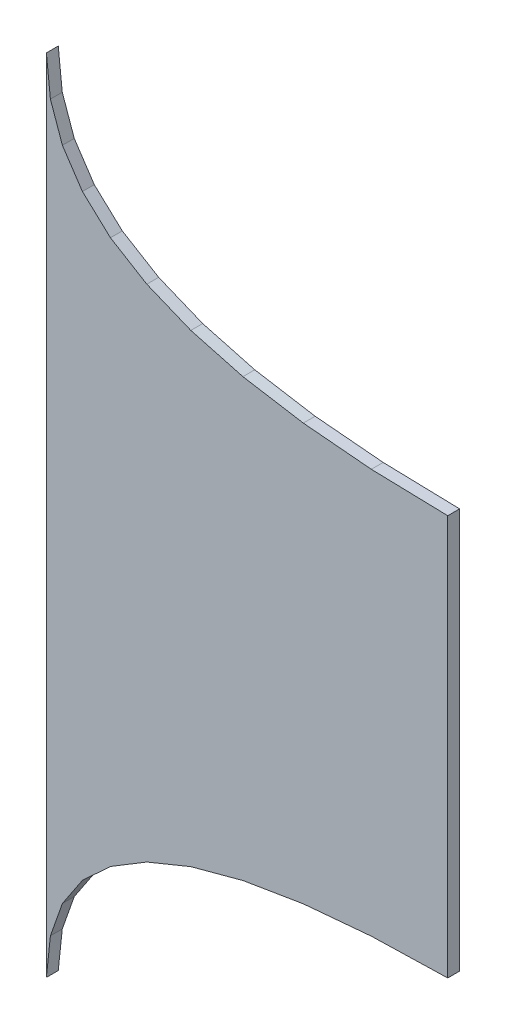
ISO-10303-21;
HEADER;
FILE_DESCRIPTION(('STEP AP214'),'2;1');
FILE_NAME('part.step','',(''),(''),'','','');
FILE_SCHEMA(('AUTOMOTIVE_DESIGN { 1 0 10303 214 1 1 1 1 }'));
ENDSEC;
DATA;
#1=APPLICATION_CONTEXT('core data for automotive mechanical design processes');
#2=APPLICATION_PROTOCOL_DEFINITION('international standard','automotive_design',2000,#1);
#3=PRODUCT_CONTEXT('',#1,'mechanical');
#4=PRODUCT('Part','Part','',(#3));
#5=PRODUCT_RELATED_PRODUCT_CATEGORY('part','',(#4));
#6=PRODUCT_DEFINITION_FORMATION('','',#4);
#7=PRODUCT_DEFINITION_CONTEXT('part definition',#1,'design');
#8=PRODUCT_DEFINITION('design','',#6,#7);
#9=PRODUCT_DEFINITION_SHAPE('','',#8);
#10=(LENGTH_UNIT() NAMED_UNIT(*) SI_UNIT(.MILLI.,.METRE.));
#11=(NAMED_UNIT(*) PLANE_ANGLE_UNIT() SI_UNIT($,.RADIAN.));
#12=(NAMED_UNIT(*) SI_UNIT($,.STERADIAN.) SOLID_ANGLE_UNIT());
#13=UNCERTAINTY_MEASURE_WITH_UNIT(LENGTH_MEASURE(1.E-05),#10,'distance_accuracy_value','');
#14=(GEOMETRIC_REPRESENTATION_CONTEXT(3) GLOBAL_UNCERTAINTY_ASSIGNED_CONTEXT((#13)) GLOBAL_UNIT_ASSIGNED_CONTEXT((#10,
#11,#12)) REPRESENTATION_CONTEXT('',''));
#15=CARTESIAN_POINT('',(0.,0.,0.));
#16=DIRECTION('',(0.,0.,1.));
#17=DIRECTION('',(1.,0.,0.));
#18=AXIS2_PLACEMENT_3D('',#15,#16,#17);
#19=CARTESIAN_POINT('',(99.0970001220703,43.0999984741211,0.));
#20=DIRECTION('',(-0.0261937013908994,-0.999656886140162,0.));
#21=DIRECTION('',(-0.999656886140162,0.0261937013908994,0.));
#22=AXIS2_PLACEMENT_3D('',#19,#20,#21);
#23=PLANE('',#22);
#24=DIRECTION('',(-0.999656886140162,0.0261937013908994,0.));
#25=VECTOR('',#24,1.);
#26=CARTESIAN_POINT('',(99.0970001220703,43.0999984741211,0.03556));
#27=LINE('',#26,#25);
#28=CARTESIAN_POINT('',(99.0970001220703,43.0999984741211,0.03556));
#29=VERTEX_POINT('',#28);
#30=CARTESIAN_POINT('',(98.8679962158203,43.1059989929199,0.03556));
#31=VERTEX_POINT('',#30);
#32=EDGE_CURVE('E11',#29,#31,#27,.T.);
#33=ORIENTED_EDGE('',*,*,#32,.F.);
#34=DIRECTION('',(0.,0.,1.));
#35=VECTOR('',#34,1.);
#36=CARTESIAN_POINT('',(99.0970001220703,43.0999984741211,0.));
#37=LINE('',#36,#35);
#38=CARTESIAN_POINT('',(99.0970001220703,43.0999984741211,0.));
#39=VERTEX_POINT('',#38);
#40=EDGE_CURVE('E24',#39,#29,#37,.T.);
#41=ORIENTED_EDGE('',*,*,#40,.F.);
#42=DIRECTION('',(-0.999656886140162,0.0261937013908994,0.));
#43=VECTOR('',#42,1.);
#44=CARTESIAN_POINT('',(99.0970001220703,43.0999984741211,0.));
#45=LINE('',#44,#43);
#46=CARTESIAN_POINT('',(98.8679962158203,43.1059989929199,0.));
#47=VERTEX_POINT('',#46);
#48=EDGE_CURVE('E184',#39,#47,#45,.T.);
#49=ORIENTED_EDGE('',*,*,#48,.T.);
#50=DIRECTION('',(0.,0.,1.));
#51=VECTOR('',#50,1.);
#52=CARTESIAN_POINT('',(98.8679962158203,43.1059989929199,0.));
#53=LINE('',#52,#51);
#54=EDGE_CURVE('E37',#47,#31,#53,.T.);
#55=ORIENTED_EDGE('',*,*,#54,.T.);
#56=EDGE_LOOP('',(#33,#41,#49,#55));
#57=FACE_BOUND('',#56,.T.);
#58=ADVANCED_FACE('F17',(#57),#23,.F.);
#59=CARTESIAN_POINT('',(98.8679962158203,43.1059989929199,0.));
#60=DIRECTION('',(-0.0879035957727116,-0.996128986552559,0.));
#61=DIRECTION('',(-0.996128986552559,0.0879035957727116,0.));
#62=AXIS2_PLACEMENT_3D('',#59,#60,#61);
#63=PLANE('',#62);
#64=DIRECTION('',(-0.996128986552559,0.0879035957727116,0.));
#65=VECTOR('',#64,1.);
#66=CARTESIAN_POINT('',(98.8679962158203,43.1059989929199,0.03556));
#67=LINE('',#66,#65);
#68=CARTESIAN_POINT('',(98.6640014648438,43.1240005493164,0.03556));
#69=VERTEX_POINT('',#68);
#70=EDGE_CURVE('E336',#31,#69,#67,.T.);
#71=ORIENTED_EDGE('',*,*,#70,.F.);
#72=ORIENTED_EDGE('',*,*,#54,.F.);
#73=DIRECTION('',(-0.996128986552559,0.0879035957727116,0.));
#74=VECTOR('',#73,1.);
#75=CARTESIAN_POINT('',(98.8679962158203,43.1059989929199,0.));
#76=LINE('',#75,#74);
#77=CARTESIAN_POINT('',(98.6640014648438,43.1240005493164,0.));
#78=VERTEX_POINT('',#77);
#79=EDGE_CURVE('E333',#47,#78,#76,.T.);
#80=ORIENTED_EDGE('',*,*,#79,.T.);
#81=DIRECTION('',(0.,0.,1.));
#82=VECTOR('',#81,1.);
#83=CARTESIAN_POINT('',(98.6640014648438,43.1240005493164,0.));
#84=LINE('',#83,#82);
#85=EDGE_CURVE('E331',#78,#69,#84,.T.);
#86=ORIENTED_EDGE('',*,*,#85,.T.);
#87=EDGE_LOOP('',(#71,#72,#80,#86));
#88=FACE_BOUND('',#87,.T.);
#89=ADVANCED_FACE('F344',(#88),#63,.F.);
#90=CARTESIAN_POINT('',(98.6640014648438,43.1240005493164,0.));
#91=DIRECTION('',(-0.163508795228012,-0.986541876396073,0.));
#92=DIRECTION('',(-0.986541876396073,0.163508795228012,0.));
#93=AXIS2_PLACEMENT_3D('',#90,#91,#92);
#94=PLANE('',#93);
#95=DIRECTION('',(-0.986541876396073,0.163508795228012,0.));
#96=VECTOR('',#95,1.);
#97=CARTESIAN_POINT('',(98.6640014648438,43.1240005493164,0.03556));
#98=LINE('',#97,#96);
#99=CARTESIAN_POINT('',(98.4830017089844,43.1539993286133,0.03556));
#100=VERTEX_POINT('',#99);
#101=EDGE_CURVE('E328',#69,#100,#98,.T.);
#102=ORIENTED_EDGE('',*,*,#101,.F.);
#103=ORIENTED_EDGE('',*,*,#85,.F.);
#104=DIRECTION('',(-0.986541876396073,0.163508795228012,0.));
#105=VECTOR('',#104,1.);
#106=CARTESIAN_POINT('',(98.6640014648438,43.1240005493164,0.));
#107=LINE('',#106,#105);
#108=CARTESIAN_POINT('',(98.4830017089844,43.1539993286133,0.));
#109=VERTEX_POINT('',#108);
#110=EDGE_CURVE('E325',#78,#109,#107,.T.);
#111=ORIENTED_EDGE('',*,*,#110,.T.);
#112=DIRECTION('',(0.,0.,1.));
#113=VECTOR('',#112,1.);
#114=CARTESIAN_POINT('',(98.4830017089844,43.1539993286133,0.));
#115=LINE('',#114,#113);
#116=EDGE_CURVE('E323',#109,#100,#115,.T.);
#117=ORIENTED_EDGE('',*,*,#116,.T.);
#118=EDGE_LOOP('',(#102,#103,#111,#117));
#119=FACE_BOUND('',#118,.T.);
#120=ADVANCED_FACE('F350',(#119),#94,.F.);
#121=CARTESIAN_POINT('',(98.4830017089844,43.1539993286133,0.));
#122=DIRECTION('',(-0.259975167043725,-0.965615302550963,0.));
#123=DIRECTION('',(-0.965615302550963,0.259975167043725,0.));
#124=AXIS2_PLACEMENT_3D('',#121,#122,#123);
#125=PLANE('',#124);
#126=DIRECTION('',(-0.965615302550963,0.259975167043725,0.));
#127=VECTOR('',#126,1.);
#128=CARTESIAN_POINT('',(98.4830017089844,43.1539993286133,0.03556));
#129=LINE('',#128,#127);
#130=CARTESIAN_POINT('',(98.3270034790039,43.1959991455078,0.03556));
#131=VERTEX_POINT('',#130);
#132=EDGE_CURVE('E320',#100,#131,#129,.T.);
#133=ORIENTED_EDGE('',*,*,#132,.F.);
#134=ORIENTED_EDGE('',*,*,#116,.F.);
#135=DIRECTION('',(-0.965615302550963,0.259975167043725,0.));
#136=VECTOR('',#135,1.);
#137=CARTESIAN_POINT('',(98.4830017089844,43.1539993286133,0.));
#138=LINE('',#137,#136);
#139=CARTESIAN_POINT('',(98.3270034790039,43.1959991455078,0.));
#140=VERTEX_POINT('',#139);
#141=EDGE_CURVE('E317',#109,#140,#138,.T.);
#142=ORIENTED_EDGE('',*,*,#141,.T.);
#143=DIRECTION('',(0.,0.,1.));
#144=VECTOR('',#143,1.);
#145=CARTESIAN_POINT('',(98.3270034790039,43.1959991455078,0.));
#146=LINE('',#145,#144);
#147=EDGE_CURVE('E315',#140,#131,#146,.T.);
#148=ORIENTED_EDGE('',*,*,#147,.T.);
#149=EDGE_LOOP('',(#133,#134,#142,#148));
#150=FACE_BOUND('',#149,.T.);
#151=ADVANCED_FACE('F352',(#150),#125,.F.);
#152=CARTESIAN_POINT('',(98.3270034790039,43.1959991455078,0.));
#153=DIRECTION('',(-0.378628679832623,-0.925548660421593,0.));
#154=DIRECTION('',(-0.925548660421593,0.378628679832623,0.));
#155=AXIS2_PLACEMENT_3D('',#152,#153,#154);
#156=PLANE('',#155);
#157=DIRECTION('',(-0.925548660421593,0.378628679832623,0.));
#158=VECTOR('',#157,1.);
#159=CARTESIAN_POINT('',(98.3270034790039,43.1959991455078,0.03556));
#160=LINE('',#159,#158);
#161=CARTESIAN_POINT('',(98.1949996948242,43.25,0.03556));
#162=VERTEX_POINT('',#161);
#163=EDGE_CURVE('E312',#131,#162,#160,.T.);
#164=ORIENTED_EDGE('',*,*,#163,.F.);
#165=ORIENTED_EDGE('',*,*,#147,.F.);
#166=DIRECTION('',(-0.925548660421593,0.378628679832623,0.));
#167=VECTOR('',#166,1.);
#168=CARTESIAN_POINT('',(98.3270034790039,43.1959991455078,0.));
#169=LINE('',#168,#167);
#170=CARTESIAN_POINT('',(98.1949996948242,43.25,0.));
#171=VERTEX_POINT('',#170);
#172=EDGE_CURVE('E309',#140,#171,#169,.T.);
#173=ORIENTED_EDGE('',*,*,#172,.T.);
#174=DIRECTION('',(0.,0.,1.));
#175=VECTOR('',#174,1.);
#176=CARTESIAN_POINT('',(98.1949996948242,43.25,0.));
#177=LINE('',#176,#175);
#178=EDGE_CURVE('E307',#171,#162,#177,.T.);
#179=ORIENTED_EDGE('',*,*,#178,.T.);
#180=EDGE_LOOP('',(#164,#165,#173,#179));
#181=FACE_BOUND('',#180,.T.);
#182=ADVANCED_FACE('F357',(#181),#156,.F.);
#183=CARTESIAN_POINT('',(98.1949996948242,43.25,0.));
#184=DIRECTION('',(-0.517960652550735,-0.855404443762842,0.));
#185=DIRECTION('',(-0.855404443762842,0.517960652550735,0.));
#186=AXIS2_PLACEMENT_3D('',#183,#184,#185);
#187=PLANE('',#186);
#188=DIRECTION('',(-0.855404443762842,0.517960652550735,0.));
#189=VECTOR('',#188,1.);
#190=CARTESIAN_POINT('',(98.1949996948242,43.25,0.03556));
#191=LINE('',#190,#189);
#192=CARTESIAN_POINT('',(98.0859985351562,43.3160018920898,0.03556));
#193=VERTEX_POINT('',#192);
#194=EDGE_CURVE('E304',#162,#193,#191,.T.);
#195=ORIENTED_EDGE('',*,*,#194,.F.);
#196=ORIENTED_EDGE('',*,*,#178,.F.);
#197=DIRECTION('',(-0.855404443762842,0.517960652550735,0.));
#198=VECTOR('',#197,1.);
#199=CARTESIAN_POINT('',(98.1949996948242,43.25,0.));
#200=LINE('',#199,#198);
#201=CARTESIAN_POINT('',(98.0859985351562,43.3160018920898,0.));
#202=VERTEX_POINT('',#201);
#203=EDGE_CURVE('E301',#171,#202,#200,.T.);
#204=ORIENTED_EDGE('',*,*,#203,.T.);
#205=DIRECTION('',(0.,0.,1.));
#206=VECTOR('',#205,1.);
#207=CARTESIAN_POINT('',(98.0859985351562,43.3160018920898,0.));
#208=LINE('',#207,#206);
#209=EDGE_CURVE('E299',#202,#193,#208,.T.);
#210=ORIENTED_EDGE('',*,*,#209,.T.);
#211=EDGE_LOOP('',(#195,#196,#204,#210));
#212=FACE_BOUND('',#211,.T.);
#213=ADVANCED_FACE('F360',(#212),#187,.F.);
#214=CARTESIAN_POINT('',(98.0859985351562,43.3160018920898,0.));
#215=DIRECTION('',(-0.680448546480447,-0.73279586215579,0.));
#216=DIRECTION('',(-0.73279586215579,0.680448546480447,0.));
#217=AXIS2_PLACEMENT_3D('',#214,#215,#216);
#218=PLANE('',#217);
#219=DIRECTION('',(-0.73279586215579,0.680448546480447,0.));
#220=VECTOR('',#219,1.);
#221=CARTESIAN_POINT('',(98.0859985351562,43.3160018920898,0.03556));
#222=LINE('',#221,#220);
#223=CARTESIAN_POINT('',(98.0019989013672,43.3940010070801,0.03556));
#224=VERTEX_POINT('',#223);
#225=EDGE_CURVE('E296',#193,#224,#222,.T.);
#226=ORIENTED_EDGE('',*,*,#225,.F.);
#227=ORIENTED_EDGE('',*,*,#209,.F.);
#228=DIRECTION('',(-0.73279586215579,0.680448546480447,0.));
#229=VECTOR('',#228,1.);
#230=CARTESIAN_POINT('',(98.0859985351562,43.3160018920898,0.));
#231=LINE('',#230,#229);
#232=CARTESIAN_POINT('',(98.0019989013672,43.3940010070801,0.));
#233=VERTEX_POINT('',#232);
#234=EDGE_CURVE('E293',#202,#233,#231,.T.);
#235=ORIENTED_EDGE('',*,*,#234,.T.);
#236=DIRECTION('',(0.,0.,1.));
#237=VECTOR('',#236,1.);
#238=CARTESIAN_POINT('',(98.0019989013672,43.3940010070801,0.));
#239=LINE('',#238,#237);
#240=EDGE_CURVE('E291',#233,#224,#239,.T.);
#241=ORIENTED_EDGE('',*,*,#240,.T.);
#242=EDGE_LOOP('',(#226,#227,#235,#241));
#243=FACE_BOUND('',#242,.T.);
#244=ADVANCED_FACE('F365',(#243),#218,.F.);
#245=CARTESIAN_POINT('',(98.0019989013672,43.3940010070801,0.));
#246=DIRECTION('',(-0.83206114565212,-0.554683918908852,0.));
#247=DIRECTION('',(-0.554683918908852,0.83206114565212,0.));
#248=AXIS2_PLACEMENT_3D('',#245,#246,#247);
#249=PLANE('',#248);
#250=DIRECTION('',(-0.554683918908852,0.83206114565212,0.));
#251=VECTOR('',#250,1.);
#252=CARTESIAN_POINT('',(98.0019989013672,43.3940010070801,0.03556));
#253=LINE('',#252,#251);
#254=CARTESIAN_POINT('',(97.9420013427734,43.484001159668,0.03556));
#255=VERTEX_POINT('',#254);
#256=EDGE_CURVE('E288',#224,#255,#253,.T.);
#257=ORIENTED_EDGE('',*,*,#256,.F.);
#258=ORIENTED_EDGE('',*,*,#240,.F.);
#259=DIRECTION('',(-0.554683918908852,0.83206114565212,0.));
#260=VECTOR('',#259,1.);
#261=CARTESIAN_POINT('',(98.0019989013672,43.3940010070801,0.));
#262=LINE('',#261,#260);
#263=CARTESIAN_POINT('',(97.9420013427734,43.484001159668,0.));
#264=VERTEX_POINT('',#263);
#265=EDGE_CURVE('E285',#233,#264,#262,.T.);
#266=ORIENTED_EDGE('',*,*,#265,.T.);
#267=DIRECTION('',(0.,0.,1.));
#268=VECTOR('',#267,1.);
#269=CARTESIAN_POINT('',(97.9420013427734,43.484001159668,0.));
#270=LINE('',#269,#268);
#271=EDGE_CURVE('E283',#264,#255,#270,.T.);
#272=ORIENTED_EDGE('',*,*,#271,.T.);
#273=EDGE_LOOP('',(#257,#258,#266,#272));
#274=FACE_BOUND('',#273,.T.);
#275=ADVANCED_FACE('F368',(#274),#249,.F.);
#276=CARTESIAN_POINT('',(97.9420013427734,43.484001159668,0.));
#277=DIRECTION('',(-0.942978613383964,-0.33285332310262,0.));
#278=DIRECTION('',(-0.33285332310262,0.942978613383964,0.));
#279=AXIS2_PLACEMENT_3D('',#276,#277,#278);
#280=PLANE('',#279);
#281=DIRECTION('',(-0.33285332310262,0.942978613383964,0.));
#282=VECTOR('',#281,1.);
#283=CARTESIAN_POINT('',(97.9420013427734,43.484001159668,0.03556));
#284=LINE('',#283,#282);
#285=CARTESIAN_POINT('',(97.9059982299805,43.5859985351562,0.03556));
#286=VERTEX_POINT('',#285);
#287=EDGE_CURVE('E280',#255,#286,#284,.T.);
#288=ORIENTED_EDGE('',*,*,#287,.F.);
#289=ORIENTED_EDGE('',*,*,#271,.F.);
#290=DIRECTION('',(-0.33285332310262,0.942978613383964,0.));
#291=VECTOR('',#290,1.);
#292=CARTESIAN_POINT('',(97.9420013427734,43.484001159668,0.));
#293=LINE('',#292,#291);
#294=CARTESIAN_POINT('',(97.9059982299805,43.5859985351562,0.));
#295=VERTEX_POINT('',#294);
#296=EDGE_CURVE('E277',#264,#295,#293,.T.);
#297=ORIENTED_EDGE('',*,*,#296,.T.);
#298=DIRECTION('',(0.,0.,1.));
#299=VECTOR('',#298,1.);
#300=CARTESIAN_POINT('',(97.9059982299805,43.5859985351562,0.));
#301=LINE('',#300,#299);
#302=EDGE_CURVE('E275',#295,#286,#301,.T.);
#303=ORIENTED_EDGE('',*,*,#302,.T.);
#304=EDGE_LOOP('',(#288,#289,#297,#303));
#305=FACE_BOUND('',#304,.T.);
#306=ADVANCED_FACE('F373',(#305),#280,.F.);
#307=CARTESIAN_POINT('',(97.9059982299805,43.5859985351562,0.));
#308=DIRECTION('',(-0.994504723522538,-0.104691713575436,0.));
#309=DIRECTION('',(-0.104691713575436,0.994504723522538,0.));
#310=AXIS2_PLACEMENT_3D('',#307,#308,#309);
#311=PLANE('',#310);
#312=DIRECTION('',(-0.104691713575436,0.994504723522537,0.));
#313=VECTOR('',#312,1.);
#314=CARTESIAN_POINT('',(97.9059982299805,43.5859985351562,0.03556));
#315=LINE('',#314,#313);
#316=CARTESIAN_POINT('',(97.8939971923828,43.7000007629395,0.03556));
#317=VERTEX_POINT('',#316);
#318=EDGE_CURVE('E272',#286,#317,#315,.T.);
#319=ORIENTED_EDGE('',*,*,#318,.F.);
#320=ORIENTED_EDGE('',*,*,#302,.F.);
#321=DIRECTION('',(-0.104691713575436,0.994504723522537,0.));
#322=VECTOR('',#321,1.);
#323=CARTESIAN_POINT('',(97.9059982299805,43.5859985351562,0.));
#324=LINE('',#323,#322);
#325=CARTESIAN_POINT('',(97.8939971923828,43.7000007629395,0.));
#326=VERTEX_POINT('',#325);
#327=EDGE_CURVE('E269',#295,#326,#324,.T.);
#328=ORIENTED_EDGE('',*,*,#327,.T.);
#329=DIRECTION('',(0.,0.,1.));
#330=VECTOR('',#329,1.);
#331=CARTESIAN_POINT('',(97.8939971923828,43.7000007629395,0.));
#332=LINE('',#331,#330);
#333=EDGE_CURVE('E267',#326,#317,#332,.T.);
#334=ORIENTED_EDGE('',*,*,#333,.T.);
#335=EDGE_LOOP('',(#319,#320,#328,#334));
#336=FACE_BOUND('',#335,.T.);
#337=ADVANCED_FACE('F376',(#336),#311,.F.);
#338=CARTESIAN_POINT('',(97.8939971923828,43.7000007629395,0.));
#339=DIRECTION('',(1.,0.,0.));
#340=DIRECTION('',(0.,-1.,0.));
#341=AXIS2_PLACEMENT_3D('',#338,#339,#340);
#342=PLANE('',#341);
#343=DIRECTION('',(0.,-1.,0.));
#344=VECTOR('',#343,1.);
#345=CARTESIAN_POINT('',(97.8939971923828,43.7000007629395,0.03556));
#346=LINE('',#345,#344);
#347=CARTESIAN_POINT('',(97.8939971923828,41.2999992370605,0.03556));
#348=VERTEX_POINT('',#347);
#349=EDGE_CURVE('E264',#317,#348,#346,.T.);
#350=ORIENTED_EDGE('',*,*,#349,.F.);
#351=ORIENTED_EDGE('',*,*,#333,.F.);
#352=DIRECTION('',(0.,-1.,0.));
#353=VECTOR('',#352,1.);
#354=CARTESIAN_POINT('',(97.8939971923828,43.7000007629395,0.));
#355=LINE('',#354,#353);
#356=CARTESIAN_POINT('',(97.8939971923828,41.2999992370605,0.));
#357=VERTEX_POINT('',#356);
#358=EDGE_CURVE('E261',#326,#357,#355,.T.);
#359=ORIENTED_EDGE('',*,*,#358,.T.);
#360=DIRECTION('',(0.,0.,1.));
#361=VECTOR('',#360,1.);
#362=CARTESIAN_POINT('',(97.8939971923828,41.2999992370605,0.));
#363=LINE('',#362,#361);
#364=EDGE_CURVE('E259',#357,#348,#363,.T.);
#365=ORIENTED_EDGE('',*,*,#364,.T.);
#366=EDGE_LOOP('',(#350,#351,#359,#365));
#367=FACE_BOUND('',#366,.T.);
#368=ADVANCED_FACE('F381',(#367),#342,.F.);
#369=CARTESIAN_POINT('',(97.8939971923828,41.2999992370605,0.));
#370=DIRECTION('',(-0.994504723522538,0.104691713575436,0.));
#371=DIRECTION('',(0.104691713575436,0.994504723522538,0.));
#372=AXIS2_PLACEMENT_3D('',#369,#370,#371);
#373=PLANE('',#372);
#374=DIRECTION('',(0.104691713575436,0.994504723522537,0.));
#375=VECTOR('',#374,1.);
#376=CARTESIAN_POINT('',(97.8939971923828,41.2999992370605,0.03556));
#377=LINE('',#376,#375);
#378=CARTESIAN_POINT('',(97.9059982299805,41.4140014648437,0.03556));
#379=VERTEX_POINT('',#378);
#380=EDGE_CURVE('E256',#348,#379,#377,.T.);
#381=ORIENTED_EDGE('',*,*,#380,.F.);
#382=ORIENTED_EDGE('',*,*,#364,.F.);
#383=DIRECTION('',(0.104691713575436,0.994504723522537,0.));
#384=VECTOR('',#383,1.);
#385=CARTESIAN_POINT('',(97.8939971923828,41.2999992370605,0.));
#386=LINE('',#385,#384);
#387=CARTESIAN_POINT('',(97.9059982299805,41.4140014648437,0.));
#388=VERTEX_POINT('',#387);
#389=EDGE_CURVE('E253',#357,#388,#386,.T.);
#390=ORIENTED_EDGE('',*,*,#389,.T.);
#391=DIRECTION('',(0.,0.,1.));
#392=VECTOR('',#391,1.);
#393=CARTESIAN_POINT('',(97.9059982299805,41.4140014648437,0.));
#394=LINE('',#393,#392);
#395=EDGE_CURVE('E251',#388,#379,#394,.T.);
#396=ORIENTED_EDGE('',*,*,#395,.T.);
#397=EDGE_LOOP('',(#381,#382,#390,#396));
#398=FACE_BOUND('',#397,.T.);
#399=ADVANCED_FACE('F384',(#398),#373,.F.);
#400=CARTESIAN_POINT('',(97.9059982299805,41.4140014648437,0.));
#401=DIRECTION('',(-0.942978613383964,0.33285332310262,0.));
#402=DIRECTION('',(0.33285332310262,0.942978613383964,0.));
#403=AXIS2_PLACEMENT_3D('',#400,#401,#402);
#404=PLANE('',#403);
#405=DIRECTION('',(0.33285332310262,0.942978613383964,0.));
#406=VECTOR('',#405,1.);
#407=CARTESIAN_POINT('',(97.9059982299805,41.4140014648437,0.03556));
#408=LINE('',#407,#406);
#409=CARTESIAN_POINT('',(97.9420013427734,41.515998840332,0.03556));
#410=VERTEX_POINT('',#409);
#411=EDGE_CURVE('E248',#379,#410,#408,.T.);
#412=ORIENTED_EDGE('',*,*,#411,.F.);
#413=ORIENTED_EDGE('',*,*,#395,.F.);
#414=DIRECTION('',(0.33285332310262,0.942978613383964,0.));
#415=VECTOR('',#414,1.);
#416=CARTESIAN_POINT('',(97.9059982299805,41.4140014648437,0.));
#417=LINE('',#416,#415);
#418=CARTESIAN_POINT('',(97.9420013427734,41.515998840332,0.));
#419=VERTEX_POINT('',#418);
#420=EDGE_CURVE('E245',#388,#419,#417,.T.);
#421=ORIENTED_EDGE('',*,*,#420,.T.);
#422=DIRECTION('',(0.,0.,1.));
#423=VECTOR('',#422,1.);
#424=CARTESIAN_POINT('',(97.9420013427734,41.515998840332,0.));
#425=LINE('',#424,#423);
#426=EDGE_CURVE('E243',#419,#410,#425,.T.);
#427=ORIENTED_EDGE('',*,*,#426,.T.);
#428=EDGE_LOOP('',(#412,#413,#421,#427));
#429=FACE_BOUND('',#428,.T.);
#430=ADVANCED_FACE('F389',(#429),#404,.F.);
#431=CARTESIAN_POINT('',(97.9420013427734,41.515998840332,0.));
#432=DIRECTION('',(-0.83206114565212,0.554683918908852,0.));
#433=DIRECTION('',(0.554683918908852,0.83206114565212,0.));
#434=AXIS2_PLACEMENT_3D('',#431,#432,#433);
#435=PLANE('',#434);
#436=DIRECTION('',(0.554683918908852,0.83206114565212,0.));
#437=VECTOR('',#436,1.);
#438=CARTESIAN_POINT('',(97.9420013427734,41.515998840332,0.03556));
#439=LINE('',#438,#437);
#440=CARTESIAN_POINT('',(98.0019989013672,41.6059989929199,0.03556));
#441=VERTEX_POINT('',#440);
#442=EDGE_CURVE('E240',#410,#441,#439,.T.);
#443=ORIENTED_EDGE('',*,*,#442,.F.);
#444=ORIENTED_EDGE('',*,*,#426,.F.);
#445=DIRECTION('',(0.554683918908852,0.83206114565212,0.));
#446=VECTOR('',#445,1.);
#447=CARTESIAN_POINT('',(97.9420013427734,41.515998840332,0.));
#448=LINE('',#447,#446);
#449=CARTESIAN_POINT('',(98.0019989013672,41.6059989929199,0.));
#450=VERTEX_POINT('',#449);
#451=EDGE_CURVE('E237',#419,#450,#448,.T.);
#452=ORIENTED_EDGE('',*,*,#451,.T.);
#453=DIRECTION('',(0.,0.,1.));
#454=VECTOR('',#453,1.);
#455=CARTESIAN_POINT('',(98.0019989013672,41.6059989929199,0.));
#456=LINE('',#455,#454);
#457=EDGE_CURVE('E235',#450,#441,#456,.T.);
#458=ORIENTED_EDGE('',*,*,#457,.T.);
#459=EDGE_LOOP('',(#443,#444,#452,#458));
#460=FACE_BOUND('',#459,.T.);
#461=ADVANCED_FACE('F392',(#460),#435,.F.);
#462=CARTESIAN_POINT('',(98.0019989013672,41.6059989929199,0.));
#463=DIRECTION('',(-0.680448546480447,0.73279586215579,0.));
#464=DIRECTION('',(0.73279586215579,0.680448546480447,0.));
#465=AXIS2_PLACEMENT_3D('',#462,#463,#464);
#466=PLANE('',#465);
#467=DIRECTION('',(0.73279586215579,0.680448546480447,0.));
#468=VECTOR('',#467,1.);
#469=CARTESIAN_POINT('',(98.0019989013672,41.6059989929199,0.03556));
#470=LINE('',#469,#468);
#471=CARTESIAN_POINT('',(98.0859985351562,41.6839981079102,0.03556));
#472=VERTEX_POINT('',#471);
#473=EDGE_CURVE('E232',#441,#472,#470,.T.);
#474=ORIENTED_EDGE('',*,*,#473,.F.);
#475=ORIENTED_EDGE('',*,*,#457,.F.);
#476=DIRECTION('',(0.73279586215579,0.680448546480447,0.));
#477=VECTOR('',#476,1.);
#478=CARTESIAN_POINT('',(98.0019989013672,41.6059989929199,0.));
#479=LINE('',#478,#477);
#480=CARTESIAN_POINT('',(98.0859985351562,41.6839981079102,0.));
#481=VERTEX_POINT('',#480);
#482=EDGE_CURVE('E229',#450,#481,#479,.T.);
#483=ORIENTED_EDGE('',*,*,#482,.T.);
#484=DIRECTION('',(0.,0.,1.));
#485=VECTOR('',#484,1.);
#486=CARTESIAN_POINT('',(98.0859985351562,41.6839981079102,0.));
#487=LINE('',#486,#485);
#488=EDGE_CURVE('E227',#481,#472,#487,.T.);
#489=ORIENTED_EDGE('',*,*,#488,.T.);
#490=EDGE_LOOP('',(#474,#475,#483,#489));
#491=FACE_BOUND('',#490,.T.);
#492=ADVANCED_FACE('F397',(#491),#466,.F.);
#493=CARTESIAN_POINT('',(98.0859985351562,41.6839981079102,0.));
#494=DIRECTION('',(-0.517960652550735,0.855404443762842,0.));
#495=DIRECTION('',(0.855404443762842,0.517960652550735,0.));
#496=AXIS2_PLACEMENT_3D('',#493,#494,#495);
#497=PLANE('',#496);
#498=DIRECTION('',(0.855404443762842,0.517960652550735,0.));
#499=VECTOR('',#498,1.);
#500=CARTESIAN_POINT('',(98.0859985351562,41.6839981079102,0.03556));
#501=LINE('',#500,#499);
#502=CARTESIAN_POINT('',(98.1949996948242,41.75,0.03556));
#503=VERTEX_POINT('',#502);
#504=EDGE_CURVE('E224',#472,#503,#501,.T.);
#505=ORIENTED_EDGE('',*,*,#504,.F.);
#506=ORIENTED_EDGE('',*,*,#488,.F.);
#507=DIRECTION('',(0.855404443762842,0.517960652550735,0.));
#508=VECTOR('',#507,1.);
#509=CARTESIAN_POINT('',(98.0859985351562,41.6839981079102,0.));
#510=LINE('',#509,#508);
#511=CARTESIAN_POINT('',(98.1949996948242,41.75,0.));
#512=VERTEX_POINT('',#511);
#513=EDGE_CURVE('E221',#481,#512,#510,.T.);
#514=ORIENTED_EDGE('',*,*,#513,.T.);
#515=DIRECTION('',(0.,0.,1.));
#516=VECTOR('',#515,1.);
#517=CARTESIAN_POINT('',(98.1949996948242,41.75,0.));
#518=LINE('',#517,#516);
#519=EDGE_CURVE('E219',#512,#503,#518,.T.);
#520=ORIENTED_EDGE('',*,*,#519,.T.);
#521=EDGE_LOOP('',(#505,#506,#514,#520));
#522=FACE_BOUND('',#521,.T.);
#523=ADVANCED_FACE('F400',(#522),#497,.F.);
#524=CARTESIAN_POINT('',(98.1949996948242,41.75,0.));
#525=DIRECTION('',(-0.378628679832623,0.925548660421593,0.));
#526=DIRECTION('',(0.925548660421593,0.378628679832623,0.));
#527=AXIS2_PLACEMENT_3D('',#524,#525,#526);
#528=PLANE('',#527);
#529=DIRECTION('',(0.925548660421593,0.378628679832623,0.));
#530=VECTOR('',#529,1.);
#531=CARTESIAN_POINT('',(98.1949996948242,41.75,0.03556));
#532=LINE('',#531,#530);
#533=CARTESIAN_POINT('',(98.3270034790039,41.8040008544922,0.03556));
#534=VERTEX_POINT('',#533);
#535=EDGE_CURVE('E216',#503,#534,#532,.T.);
#536=ORIENTED_EDGE('',*,*,#535,.F.);
#537=ORIENTED_EDGE('',*,*,#519,.F.);
#538=DIRECTION('',(0.925548660421593,0.378628679832623,0.));
#539=VECTOR('',#538,1.);
#540=CARTESIAN_POINT('',(98.1949996948242,41.75,0.));
#541=LINE('',#540,#539);
#542=CARTESIAN_POINT('',(98.3270034790039,41.8040008544922,0.));
#543=VERTEX_POINT('',#542);
#544=EDGE_CURVE('E213',#512,#543,#541,.T.);
#545=ORIENTED_EDGE('',*,*,#544,.T.);
#546=DIRECTION('',(0.,0.,1.));
#547=VECTOR('',#546,1.);
#548=CARTESIAN_POINT('',(98.3270034790039,41.8040008544922,0.));
#549=LINE('',#548,#547);
#550=EDGE_CURVE('E211',#543,#534,#549,.T.);
#551=ORIENTED_EDGE('',*,*,#550,.T.);
#552=EDGE_LOOP('',(#536,#537,#545,#551));
#553=FACE_BOUND('',#552,.T.);
#554=ADVANCED_FACE('F405',(#553),#528,.F.);
#555=CARTESIAN_POINT('',(98.3270034790039,41.8040008544922,0.));
#556=DIRECTION('',(-0.259975167043725,0.965615302550963,0.));
#557=DIRECTION('',(0.965615302550963,0.259975167043725,0.));
#558=AXIS2_PLACEMENT_3D('',#555,#556,#557);
#559=PLANE('',#558);
#560=DIRECTION('',(0.965615302550963,0.259975167043725,0.));
#561=VECTOR('',#560,1.);
#562=CARTESIAN_POINT('',(98.3270034790039,41.8040008544922,0.03556));
#563=LINE('',#562,#561);
#564=CARTESIAN_POINT('',(98.4830017089844,41.8460006713867,0.03556));
#565=VERTEX_POINT('',#564);
#566=EDGE_CURVE('E208',#534,#565,#563,.T.);
#567=ORIENTED_EDGE('',*,*,#566,.F.);
#568=ORIENTED_EDGE('',*,*,#550,.F.);
#569=DIRECTION('',(0.965615302550963,0.259975167043725,0.));
#570=VECTOR('',#569,1.);
#571=CARTESIAN_POINT('',(98.3270034790039,41.8040008544922,0.));
#572=LINE('',#571,#570);
#573=CARTESIAN_POINT('',(98.4830017089844,41.8460006713867,0.));
#574=VERTEX_POINT('',#573);
#575=EDGE_CURVE('E205',#543,#574,#572,.T.);
#576=ORIENTED_EDGE('',*,*,#575,.T.);
#577=DIRECTION('',(0.,0.,1.));
#578=VECTOR('',#577,1.);
#579=CARTESIAN_POINT('',(98.4830017089844,41.8460006713867,0.));
#580=LINE('',#579,#578);
#581=EDGE_CURVE('E203',#574,#565,#580,.T.);
#582=ORIENTED_EDGE('',*,*,#581,.T.);
#583=EDGE_LOOP('',(#567,#568,#576,#582));
#584=FACE_BOUND('',#583,.T.);
#585=ADVANCED_FACE('F408',(#584),#559,.F.);
#586=CARTESIAN_POINT('',(98.4830017089844,41.8460006713867,0.));
#587=DIRECTION('',(-0.163508795228012,0.986541876396073,0.));
#588=DIRECTION('',(0.986541876396073,0.163508795228012,0.));
#589=AXIS2_PLACEMENT_3D('',#586,#587,#588);
#590=PLANE('',#589);
#591=DIRECTION('',(0.986541876396073,0.163508795228012,0.));
#592=VECTOR('',#591,1.);
#593=CARTESIAN_POINT('',(98.4830017089844,41.8460006713867,0.03556));
#594=LINE('',#593,#592);
#595=CARTESIAN_POINT('',(98.6640014648438,41.8759994506836,0.03556));
#596=VERTEX_POINT('',#595);
#597=EDGE_CURVE('E200',#565,#596,#594,.T.);
#598=ORIENTED_EDGE('',*,*,#597,.F.);
#599=ORIENTED_EDGE('',*,*,#581,.F.);
#600=DIRECTION('',(0.986541876396073,0.163508795228012,0.));
#601=VECTOR('',#600,1.);
#602=CARTESIAN_POINT('',(98.4830017089844,41.8460006713867,0.));
#603=LINE('',#602,#601);
#604=CARTESIAN_POINT('',(98.6640014648438,41.8759994506836,0.));
#605=VERTEX_POINT('',#604);
#606=EDGE_CURVE('E197',#574,#605,#603,.T.);
#607=ORIENTED_EDGE('',*,*,#606,.T.);
#608=DIRECTION('',(0.,0.,1.));
#609=VECTOR('',#608,1.);
#610=CARTESIAN_POINT('',(98.6640014648438,41.8759994506836,0.));
#611=LINE('',#610,#609);
#612=EDGE_CURVE('E195',#605,#596,#611,.T.);
#613=ORIENTED_EDGE('',*,*,#612,.T.);
#614=EDGE_LOOP('',(#598,#599,#607,#613));
#615=FACE_BOUND('',#614,.T.);
#616=ADVANCED_FACE('F413',(#615),#590,.F.);
#617=CARTESIAN_POINT('',(98.6640014648438,41.8759994506836,0.));
#618=DIRECTION('',(-0.0879035957727116,0.996128986552559,0.));
#619=DIRECTION('',(0.996128986552559,0.0879035957727116,0.));
#620=AXIS2_PLACEMENT_3D('',#617,#618,#619);
#621=PLANE('',#620);
#622=DIRECTION('',(0.996128986552559,0.0879035957727116,0.));
#623=VECTOR('',#622,1.);
#624=CARTESIAN_POINT('',(98.6640014648438,41.8759994506836,0.03556));
#625=LINE('',#624,#623);
#626=CARTESIAN_POINT('',(98.8679962158203,41.8940010070801,0.03556));
#627=VERTEX_POINT('',#626);
#628=EDGE_CURVE('E192',#596,#627,#625,.T.);
#629=ORIENTED_EDGE('',*,*,#628,.F.);
#630=ORIENTED_EDGE('',*,*,#612,.F.);
#631=DIRECTION('',(0.996128986552559,0.0879035957727116,0.));
#632=VECTOR('',#631,1.);
#633=CARTESIAN_POINT('',(98.6640014648438,41.8759994506836,0.));
#634=LINE('',#633,#632);
#635=CARTESIAN_POINT('',(98.8679962158203,41.8940010070801,0.));
#636=VERTEX_POINT('',#635);
#637=EDGE_CURVE('E190',#605,#636,#634,.T.);
#638=ORIENTED_EDGE('',*,*,#637,.T.);
#639=DIRECTION('',(0.,0.,1.));
#640=VECTOR('',#639,1.);
#641=CARTESIAN_POINT('',(98.8679962158203,41.8940010070801,0.));
#642=LINE('',#641,#640);
#643=EDGE_CURVE('E175',#636,#627,#642,.T.);
#644=ORIENTED_EDGE('',*,*,#643,.T.);
#645=EDGE_LOOP('',(#629,#630,#638,#644));
#646=FACE_BOUND('',#645,.T.);
#647=ADVANCED_FACE('F415',(#646),#621,.F.);
#648=CARTESIAN_POINT('',(98.8679962158203,41.8940010070801,0.));
#649=DIRECTION('',(-0.0261937013908994,0.999656886140162,0.));
#650=DIRECTION('',(0.999656886140162,0.0261937013908994,0.));
#651=AXIS2_PLACEMENT_3D('',#648,#649,#650);
#652=PLANE('',#651);
#653=DIRECTION('',(0.999656886140162,0.0261937013908994,0.));
#654=VECTOR('',#653,1.);
#655=CARTESIAN_POINT('',(98.8679962158203,41.8940010070801,0.03556));
#656=LINE('',#655,#654);
#657=CARTESIAN_POINT('',(99.0970001220703,41.9000015258789,0.03556));
#658=VERTEX_POINT('',#657);
#659=EDGE_CURVE('E179',#627,#658,#656,.T.);
#660=ORIENTED_EDGE('',*,*,#659,.F.);
#661=ORIENTED_EDGE('',*,*,#643,.F.);
#662=DIRECTION('',(0.999656886140162,0.0261937013908994,0.));
#663=VECTOR('',#662,1.);
#664=CARTESIAN_POINT('',(98.8679962158203,41.8940010070801,0.));
#665=LINE('',#664,#663);
#666=CARTESIAN_POINT('',(99.0970001220703,41.9000015258789,0.));
#667=VERTEX_POINT('',#666);
#668=EDGE_CURVE('E171',#636,#667,#665,.T.);
#669=ORIENTED_EDGE('',*,*,#668,.T.);
#670=DIRECTION('',(0.,0.,1.));
#671=VECTOR('',#670,1.);
#672=CARTESIAN_POINT('',(99.0970001220703,41.9000015258789,0.));
#673=LINE('',#672,#671);
#674=EDGE_CURVE('E161',#667,#658,#673,.T.);
#675=ORIENTED_EDGE('',*,*,#674,.T.);
#676=EDGE_LOOP('',(#660,#661,#669,#675));
#677=FACE_BOUND('',#676,.T.);
#678=ADVANCED_FACE('F174',(#677),#652,.F.);
#679=CARTESIAN_POINT('',(99.0970001220703,41.9000015258789,0.));
#680=DIRECTION('',(-1.,0.,0.));
#681=DIRECTION('',(0.,1.,0.));
#682=AXIS2_PLACEMENT_3D('',#679,#680,#681);
#683=PLANE('',#682);
#684=DIRECTION('',(0.,1.,0.));
#685=VECTOR('',#684,1.);
#686=CARTESIAN_POINT('',(99.0970001220703,41.9000015258789,0.03556));
#687=LINE('',#686,#685);
#688=EDGE_CURVE('E167',#658,#29,#687,.T.);
#689=ORIENTED_EDGE('',*,*,#688,.F.);
#690=ORIENTED_EDGE('',*,*,#674,.F.);
#691=DIRECTION('',(0.,1.,0.));
#692=VECTOR('',#691,1.);
#693=CARTESIAN_POINT('',(99.0970001220703,41.9000015258789,0.));
#694=LINE('',#693,#692);
#695=EDGE_CURVE('E165',#667,#39,#694,.T.);
#696=ORIENTED_EDGE('',*,*,#695,.T.);
#697=ORIENTED_EDGE('',*,*,#40,.T.);
#698=EDGE_LOOP('',(#689,#690,#696,#697));
#699=FACE_BOUND('',#698,.T.);
#700=ADVANCED_FACE('F163',(#699),#683,.F.);
#701=CARTESIAN_POINT('',(99.0970001220703,43.0999984741211,0.));
#702=DIRECTION('',(0.,0.,1.));
#703=DIRECTION('',(1.,0.,0.));
#704=AXIS2_PLACEMENT_3D('',#701,#702,#703);
#705=PLANE('',#704);
#706=ORIENTED_EDGE('',*,*,#695,.F.);
#707=ORIENTED_EDGE('',*,*,#668,.F.);
#708=ORIENTED_EDGE('',*,*,#637,.F.);
#709=ORIENTED_EDGE('',*,*,#606,.F.);
#710=ORIENTED_EDGE('',*,*,#575,.F.);
#711=ORIENTED_EDGE('',*,*,#544,.F.);
#712=ORIENTED_EDGE('',*,*,#513,.F.);
#713=ORIENTED_EDGE('',*,*,#482,.F.);
#714=ORIENTED_EDGE('',*,*,#451,.F.);
#715=ORIENTED_EDGE('',*,*,#420,.F.);
#716=ORIENTED_EDGE('',*,*,#389,.F.);
#717=ORIENTED_EDGE('',*,*,#358,.F.);
#718=ORIENTED_EDGE('',*,*,#327,.F.);
#719=ORIENTED_EDGE('',*,*,#296,.F.);
#720=ORIENTED_EDGE('',*,*,#265,.F.);
#721=ORIENTED_EDGE('',*,*,#234,.F.);
#722=ORIENTED_EDGE('',*,*,#203,.F.);
#723=ORIENTED_EDGE('',*,*,#172,.F.);
#724=ORIENTED_EDGE('',*,*,#141,.F.);
#725=ORIENTED_EDGE('',*,*,#110,.F.);
#726=ORIENTED_EDGE('',*,*,#79,.F.);
#727=ORIENTED_EDGE('',*,*,#48,.F.);
#728=EDGE_LOOP('',(#706,#707,#708,#709,#710,#711,#712,#713,#714,#715,#716,#717,#718,#719,#720,
#721,#722,#723,#724,#725,#726,#727));
#729=FACE_BOUND('',#728,.T.);
#730=ADVANCED_FACE('F182',(#729),#705,.F.);
#731=CARTESIAN_POINT('',(99.0970001220703,43.0999984741211,0.03556));
#732=DIRECTION('',(0.,0.,1.));
#733=DIRECTION('',(1.,0.,0.));
#734=AXIS2_PLACEMENT_3D('',#731,#732,#733);
#735=PLANE('',#734);
#736=ORIENTED_EDGE('',*,*,#32,.T.);
#737=ORIENTED_EDGE('',*,*,#70,.T.);
#738=ORIENTED_EDGE('',*,*,#101,.T.);
#739=ORIENTED_EDGE('',*,*,#132,.T.);
#740=ORIENTED_EDGE('',*,*,#163,.T.);
#741=ORIENTED_EDGE('',*,*,#194,.T.);
#742=ORIENTED_EDGE('',*,*,#225,.T.);
#743=ORIENTED_EDGE('',*,*,#256,.T.);
#744=ORIENTED_EDGE('',*,*,#287,.T.);
#745=ORIENTED_EDGE('',*,*,#318,.T.);
#746=ORIENTED_EDGE('',*,*,#349,.T.);
#747=ORIENTED_EDGE('',*,*,#380,.T.);
#748=ORIENTED_EDGE('',*,*,#411,.T.);
#749=ORIENTED_EDGE('',*,*,#442,.T.);
#750=ORIENTED_EDGE('',*,*,#473,.T.);
#751=ORIENTED_EDGE('',*,*,#504,.T.);
#752=ORIENTED_EDGE('',*,*,#535,.T.);
#753=ORIENTED_EDGE('',*,*,#566,.T.);
#754=ORIENTED_EDGE('',*,*,#597,.T.);
#755=ORIENTED_EDGE('',*,*,#628,.T.);
#756=ORIENTED_EDGE('',*,*,#659,.T.);
#757=ORIENTED_EDGE('',*,*,#688,.T.);
#758=EDGE_LOOP('',(#736,#737,#738,#739,#740,#741,#742,#743,#744,#745,#746,#747,#748,#749,#750,
#751,#752,#753,#754,#755,#756,#757));
#759=FACE_BOUND('',#758,.T.);
#760=ADVANCED_FACE('F347',(#759),#735,.T.);
#761=CLOSED_SHELL('',(#58,#89,#120,#151,#182,#213,#244,#275,#306,#337,#368,#399,#430,#461,#492,
#523,#554,#585,#616,#647,#678,#700,#730,#760));
#762=MANIFOLD_SOLID_BREP('B1',#761);
#763=ADVANCED_BREP_SHAPE_REPRESENTATION('',(#18,#762),#14);
#764=SHAPE_DEFINITION_REPRESENTATION(#9,#763);
ENDSEC;
END-ISO-10303-21;
